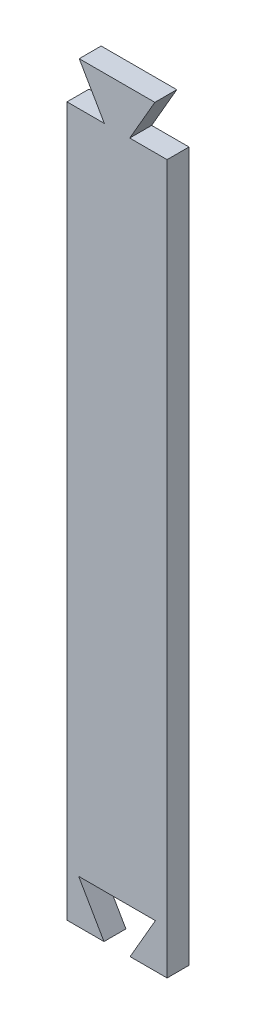
ISO-10303-21;
HEADER;
FILE_DESCRIPTION(('STEP AP214'),'2;1');
FILE_NAME('part.step','',(''),(''),'','','');
FILE_SCHEMA(('AUTOMOTIVE_DESIGN { 1 0 10303 214 1 1 1 1 }'));
ENDSEC;
DATA;
#1=APPLICATION_CONTEXT('core data for automotive mechanical design processes');
#2=APPLICATION_PROTOCOL_DEFINITION('international standard','automotive_design',2000,#1);
#3=PRODUCT_CONTEXT('',#1,'mechanical');
#4=PRODUCT('Part','Part','',(#3));
#5=PRODUCT_RELATED_PRODUCT_CATEGORY('part','',(#4));
#6=PRODUCT_DEFINITION_FORMATION('','',#4);
#7=PRODUCT_DEFINITION_CONTEXT('part definition',#1,'design');
#8=PRODUCT_DEFINITION('design','',#6,#7);
#9=PRODUCT_DEFINITION_SHAPE('','',#8);
#10=(LENGTH_UNIT() NAMED_UNIT(*) SI_UNIT(.MILLI.,.METRE.));
#11=(NAMED_UNIT(*) PLANE_ANGLE_UNIT() SI_UNIT($,.RADIAN.));
#12=(NAMED_UNIT(*) SI_UNIT($,.STERADIAN.) SOLID_ANGLE_UNIT());
#13=UNCERTAINTY_MEASURE_WITH_UNIT(LENGTH_MEASURE(1.E-05),#10,'distance_accuracy_value','');
#14=(GEOMETRIC_REPRESENTATION_CONTEXT(3) GLOBAL_UNCERTAINTY_ASSIGNED_CONTEXT((#13)) GLOBAL_UNIT_ASSIGNED_CONTEXT((#10,
#11,#12)) REPRESENTATION_CONTEXT('',''));
#15=CARTESIAN_POINT('',(0.,0.,0.));
#16=DIRECTION('',(0.,0.,1.));
#17=DIRECTION('',(1.,0.,0.));
#18=AXIS2_PLACEMENT_3D('',#15,#16,#17);
#19=CARTESIAN_POINT('',(-3.02412126503343,0.,5.08));
#20=DIRECTION('',(0.,1.,0.));
#21=DIRECTION('',(0.,0.,1.));
#22=AXIS2_PLACEMENT_3D('',#19,#20,#21);
#23=PLANE('',#22);
#24=DIRECTION('',(1.,0.,0.));
#25=VECTOR('',#24,1.);
#26=CARTESIAN_POINT('',(-3.02412126503343,0.,0.));
#27=LINE('',#26,#25);
#28=CARTESIAN_POINT('',(-11.5976146,0.,0.));
#29=VERTEX_POINT('',#28);
#30=CARTESIAN_POINT('',(-3.02412126503343,0.,0.));
#31=VERTEX_POINT('',#30);
#32=EDGE_CURVE('E163',#29,#31,#27,.T.);
#33=ORIENTED_EDGE('',*,*,#32,.T.);
#34=DIRECTION('',(0.,0.,-1.));
#35=VECTOR('',#34,1.);
#36=CARTESIAN_POINT('',(-3.02412126503343,0.,5.08));
#37=LINE('',#36,#35);
#38=CARTESIAN_POINT('',(-3.02412126503343,0.,5.08));
#39=VERTEX_POINT('',#38);
#40=EDGE_CURVE('E11',#39,#31,#37,.T.);
#41=ORIENTED_EDGE('',*,*,#40,.F.);
#42=DIRECTION('',(1.,0.,0.));
#43=VECTOR('',#42,1.);
#44=CARTESIAN_POINT('',(-3.02412126503343,0.,5.08));
#45=LINE('',#44,#43);
#46=CARTESIAN_POINT('',(-11.5976146,0.,5.08));
#47=VERTEX_POINT('',#46);
#48=EDGE_CURVE('E185',#47,#39,#45,.T.);
#49=ORIENTED_EDGE('',*,*,#48,.F.);
#50=DIRECTION('',(0.,0.,-1.));
#51=VECTOR('',#50,1.);
#52=CARTESIAN_POINT('',(-11.5976146,0.,5.08));
#53=LINE('',#52,#51);
#54=EDGE_CURVE('E159',#47,#29,#53,.T.);
#55=ORIENTED_EDGE('',*,*,#54,.T.);
#56=EDGE_LOOP('',(#33,#41,#49,#55));
#57=FACE_BOUND('',#56,.T.);
#58=ADVANCED_FACE('F43',(#57),#23,.F.);
#59=CARTESIAN_POINT('',(-3.02412126503343,0.,5.08));
#60=DIRECTION('',(-0.86602540378444,-0.499999999999998,0.));
#61=DIRECTION('',(0.499999999999998,-0.86602540378444,0.));
#62=AXIS2_PLACEMENT_3D('',#59,#60,#61);
#63=PLANE('',#62);
#64=DIRECTION('',(-0.499999999999998,0.86602540378444,0.));
#65=VECTOR('',#64,1.);
#66=CARTESIAN_POINT('',(-3.02412126503343,0.,0.));
#67=LINE('',#66,#65);
#68=CARTESIAN_POINT('',(-8.89,10.16,0.));
#69=VERTEX_POINT('',#68);
#70=EDGE_CURVE('E166',#31,#69,#67,.T.);
#71=ORIENTED_EDGE('',*,*,#70,.T.);
#72=DIRECTION('',(0.,0.,-1.));
#73=VECTOR('',#72,1.);
#74=CARTESIAN_POINT('',(-8.89,10.16,5.08));
#75=LINE('',#74,#73);
#76=CARTESIAN_POINT('',(-8.89,10.16,5.08));
#77=VERTEX_POINT('',#76);
#78=EDGE_CURVE('E51',#77,#69,#75,.T.);
#79=ORIENTED_EDGE('',*,*,#78,.F.);
#80=DIRECTION('',(-0.499999999999998,0.86602540378444,0.));
#81=VECTOR('',#80,1.);
#82=CARTESIAN_POINT('',(-3.02412126503343,0.,5.08));
#83=LINE('',#82,#81);
#84=EDGE_CURVE('E114',#39,#77,#83,.T.);
#85=ORIENTED_EDGE('',*,*,#84,.F.);
#86=ORIENTED_EDGE('',*,*,#40,.T.);
#87=EDGE_LOOP('',(#71,#79,#85,#86));
#88=FACE_BOUND('',#87,.T.);
#89=ADVANCED_FACE('F263',(#88),#63,.F.);
#90=CARTESIAN_POINT('',(-8.89,10.16,5.08));
#91=DIRECTION('',(0.,1.,0.));
#92=DIRECTION('',(0.,0.,1.));
#93=AXIS2_PLACEMENT_3D('',#90,#91,#92);
#94=PLANE('',#93);
#95=DIRECTION('',(1.,0.,0.));
#96=VECTOR('',#95,1.);
#97=CARTESIAN_POINT('',(-8.89,10.16,0.));
#98=LINE('',#97,#96);
#99=CARTESIAN_POINT('',(8.89,10.16,0.));
#100=VERTEX_POINT('',#99);
#101=EDGE_CURVE('E168',#69,#100,#98,.T.);
#102=ORIENTED_EDGE('',*,*,#101,.T.);
#103=DIRECTION('',(0.,0.,-1.));
#104=VECTOR('',#103,1.);
#105=CARTESIAN_POINT('',(8.89,10.16,5.08));
#106=LINE('',#105,#104);
#107=CARTESIAN_POINT('',(8.89,10.16,5.08));
#108=VERTEX_POINT('',#107);
#109=EDGE_CURVE('E204',#108,#100,#106,.T.);
#110=ORIENTED_EDGE('',*,*,#109,.F.);
#111=DIRECTION('',(1.,0.,0.));
#112=VECTOR('',#111,1.);
#113=CARTESIAN_POINT('',(-8.89,10.16,5.08));
#114=LINE('',#113,#112);
#115=EDGE_CURVE('E212',#77,#108,#114,.T.);
#116=ORIENTED_EDGE('',*,*,#115,.F.);
#117=ORIENTED_EDGE('',*,*,#78,.T.);
#118=EDGE_LOOP('',(#102,#110,#116,#117));
#119=FACE_BOUND('',#118,.T.);
#120=ADVANCED_FACE('F210',(#119),#94,.F.);
#121=CARTESIAN_POINT('',(8.89,10.16,5.08));
#122=DIRECTION('',(0.866025403784436,-0.500000000000004,0.));
#123=DIRECTION('',(0.500000000000004,0.866025403784436,0.));
#124=AXIS2_PLACEMENT_3D('',#121,#122,#123);
#125=PLANE('',#124);
#126=DIRECTION('',(-0.500000000000004,-0.866025403784436,0.));
#127=VECTOR('',#126,1.);
#128=CARTESIAN_POINT('',(8.89,10.16,0.));
#129=LINE('',#128,#127);
#130=CARTESIAN_POINT('',(3.02412126503334,0.,0.));
#131=VERTEX_POINT('',#130);
#132=EDGE_CURVE('E170',#100,#131,#129,.T.);
#133=ORIENTED_EDGE('',*,*,#132,.T.);
#134=DIRECTION('',(0.,0.,-1.));
#135=VECTOR('',#134,1.);
#136=CARTESIAN_POINT('',(3.02412126503334,0.,5.08));
#137=LINE('',#136,#135);
#138=CARTESIAN_POINT('',(3.02412126503334,0.,5.08));
#139=VERTEX_POINT('',#138);
#140=EDGE_CURVE('E201',#139,#131,#137,.T.);
#141=ORIENTED_EDGE('',*,*,#140,.F.);
#142=DIRECTION('',(-0.500000000000004,-0.866025403784436,0.));
#143=VECTOR('',#142,1.);
#144=CARTESIAN_POINT('',(8.89,10.16,5.08));
#145=LINE('',#144,#143);
#146=EDGE_CURVE('E230',#108,#139,#145,.T.);
#147=ORIENTED_EDGE('',*,*,#146,.F.);
#148=ORIENTED_EDGE('',*,*,#109,.T.);
#149=EDGE_LOOP('',(#133,#141,#147,#148));
#150=FACE_BOUND('',#149,.T.);
#151=ADVANCED_FACE('F221',(#150),#125,.F.);
#152=CARTESIAN_POINT('',(3.02412126503334,0.,5.08));
#153=DIRECTION('',(0.,1.,0.));
#154=DIRECTION('',(0.,0.,1.));
#155=AXIS2_PLACEMENT_3D('',#152,#153,#154);
#156=PLANE('',#155);
#157=DIRECTION('',(1.,0.,0.));
#158=VECTOR('',#157,1.);
#159=CARTESIAN_POINT('',(3.02412126503334,0.,0.));
#160=LINE('',#159,#158);
#161=CARTESIAN_POINT('',(11.5976146,0.,0.));
#162=VERTEX_POINT('',#161);
#163=EDGE_CURVE('E172',#131,#162,#160,.T.);
#164=ORIENTED_EDGE('',*,*,#163,.T.);
#165=DIRECTION('',(0.,0.,-1.));
#166=VECTOR('',#165,1.);
#167=CARTESIAN_POINT('',(11.5976146,0.,5.08));
#168=LINE('',#167,#166);
#169=CARTESIAN_POINT('',(11.5976146,0.,5.08));
#170=VERTEX_POINT('',#169);
#171=EDGE_CURVE('E198',#170,#162,#168,.T.);
#172=ORIENTED_EDGE('',*,*,#171,.F.);
#173=DIRECTION('',(1.,0.,0.));
#174=VECTOR('',#173,1.);
#175=CARTESIAN_POINT('',(3.02412126503334,0.,5.08));
#176=LINE('',#175,#174);
#177=EDGE_CURVE('E227',#139,#170,#176,.T.);
#178=ORIENTED_EDGE('',*,*,#177,.F.);
#179=ORIENTED_EDGE('',*,*,#140,.T.);
#180=EDGE_LOOP('',(#164,#172,#178,#179));
#181=FACE_BOUND('',#180,.T.);
#182=ADVANCED_FACE('F225',(#181),#156,.F.);
#183=CARTESIAN_POINT('',(11.5976146,0.,5.08));
#184=DIRECTION('',(-1.,0.,0.));
#185=DIRECTION('',(0.,0.,1.));
#186=AXIS2_PLACEMENT_3D('',#183,#184,#185);
#187=PLANE('',#186);
#188=DIRECTION('',(0.,1.,0.));
#189=VECTOR('',#188,1.);
#190=CARTESIAN_POINT('',(11.5976146,0.,0.));
#191=LINE('',#190,#189);
#192=CARTESIAN_POINT('',(11.5976146,164.2364,0.));
#193=VERTEX_POINT('',#192);
#194=EDGE_CURVE('E174',#162,#193,#191,.T.);
#195=ORIENTED_EDGE('',*,*,#194,.T.);
#196=DIRECTION('',(0.,0.,-1.));
#197=VECTOR('',#196,1.);
#198=CARTESIAN_POINT('',(11.5976146,164.2364,5.08));
#199=LINE('',#198,#197);
#200=CARTESIAN_POINT('',(11.5976146,164.2364,5.08));
#201=VERTEX_POINT('',#200);
#202=EDGE_CURVE('E195',#201,#193,#199,.T.);
#203=ORIENTED_EDGE('',*,*,#202,.F.);
#204=DIRECTION('',(0.,1.,0.));
#205=VECTOR('',#204,1.);
#206=CARTESIAN_POINT('',(11.5976146,0.,5.08));
#207=LINE('',#206,#205);
#208=EDGE_CURVE('E229',#170,#201,#207,.T.);
#209=ORIENTED_EDGE('',*,*,#208,.F.);
#210=ORIENTED_EDGE('',*,*,#171,.T.);
#211=EDGE_LOOP('',(#195,#203,#209,#210));
#212=FACE_BOUND('',#211,.T.);
#213=ADVANCED_FACE('F276',(#212),#187,.F.);
#214=CARTESIAN_POINT('',(11.5976146,164.2364,5.08));
#215=DIRECTION('',(0.,-1.,0.));
#216=DIRECTION('',(0.,0.,-1.));
#217=AXIS2_PLACEMENT_3D('',#214,#215,#216);
#218=PLANE('',#217);
#219=DIRECTION('',(-1.,0.,0.));
#220=VECTOR('',#219,1.);
#221=CARTESIAN_POINT('',(11.5976146,164.2364,0.));
#222=LINE('',#221,#220);
#223=CARTESIAN_POINT('',(2.94111535554568,164.2364,0.));
#224=VERTEX_POINT('',#223);
#225=EDGE_CURVE('E176',#193,#224,#222,.T.);
#226=ORIENTED_EDGE('',*,*,#225,.T.);
#227=DIRECTION('',(0.,0.,-1.));
#228=VECTOR('',#227,1.);
#229=CARTESIAN_POINT('',(2.94111535554568,164.2364,5.08));
#230=LINE('',#229,#228);
#231=CARTESIAN_POINT('',(2.94111535554568,164.2364,5.08));
#232=VERTEX_POINT('',#231);
#233=EDGE_CURVE('E192',#232,#224,#230,.T.);
#234=ORIENTED_EDGE('',*,*,#233,.F.);
#235=DIRECTION('',(-1.,0.,0.));
#236=VECTOR('',#235,1.);
#237=CARTESIAN_POINT('',(11.5976146,164.2364,5.08));
#238=LINE('',#237,#236);
#239=EDGE_CURVE('E232',#201,#232,#238,.T.);
#240=ORIENTED_EDGE('',*,*,#239,.F.);
#241=ORIENTED_EDGE('',*,*,#202,.T.);
#242=EDGE_LOOP('',(#226,#234,#240,#241));
#243=FACE_BOUND('',#242,.T.);
#244=ADVANCED_FACE('F279',(#243),#218,.F.);
#245=CARTESIAN_POINT('',(8.763,174.3202,5.08));
#246=DIRECTION('',(-0.86602540378444,0.499999999999998,0.));
#247=DIRECTION('',(-0.499999999999998,-0.86602540378444,0.));
#248=AXIS2_PLACEMENT_3D('',#245,#246,#247);
#249=PLANE('',#248);
#250=DIRECTION('',(0.499999999999998,0.86602540378444,0.));
#251=VECTOR('',#250,1.);
#252=CARTESIAN_POINT('',(8.763,174.3202,0.));
#253=LINE('',#252,#251);
#254=CARTESIAN_POINT('',(8.763,174.3202,0.));
#255=VERTEX_POINT('',#254);
#256=EDGE_CURVE('E178',#224,#255,#253,.T.);
#257=ORIENTED_EDGE('',*,*,#256,.T.);
#258=DIRECTION('',(0.,0.,-1.));
#259=VECTOR('',#258,1.);
#260=CARTESIAN_POINT('',(8.763,174.3202,5.08));
#261=LINE('',#260,#259);
#262=CARTESIAN_POINT('',(8.763,174.3202,5.08));
#263=VERTEX_POINT('',#262);
#264=EDGE_CURVE('E189',#263,#255,#261,.T.);
#265=ORIENTED_EDGE('',*,*,#264,.F.);
#266=DIRECTION('',(0.499999999999998,0.86602540378444,0.));
#267=VECTOR('',#266,1.);
#268=CARTESIAN_POINT('',(8.763,174.3202,5.08));
#269=LINE('',#268,#267);
#270=EDGE_CURVE('E238',#232,#263,#269,.T.);
#271=ORIENTED_EDGE('',*,*,#270,.F.);
#272=ORIENTED_EDGE('',*,*,#233,.T.);
#273=EDGE_LOOP('',(#257,#265,#271,#272));
#274=FACE_BOUND('',#273,.T.);
#275=ADVANCED_FACE('F244',(#274),#249,.F.);
#276=CARTESIAN_POINT('',(-8.763,174.3202,5.08));
#277=DIRECTION('',(0.,-1.,0.));
#278=DIRECTION('',(0.,0.,-1.));
#279=AXIS2_PLACEMENT_3D('',#276,#277,#278);
#280=PLANE('',#279);
#281=DIRECTION('',(-1.,0.,0.));
#282=VECTOR('',#281,1.);
#283=CARTESIAN_POINT('',(-8.763,174.3202,0.));
#284=LINE('',#283,#282);
#285=CARTESIAN_POINT('',(-8.763,174.3202,0.));
#286=VERTEX_POINT('',#285);
#287=EDGE_CURVE('E180',#255,#286,#284,.T.);
#288=ORIENTED_EDGE('',*,*,#287,.T.);
#289=DIRECTION('',(0.,0.,-1.));
#290=VECTOR('',#289,1.);
#291=CARTESIAN_POINT('',(-8.763,174.3202,5.08));
#292=LINE('',#291,#290);
#293=CARTESIAN_POINT('',(-8.763,174.3202,5.08));
#294=VERTEX_POINT('',#293);
#295=EDGE_CURVE('E154',#294,#286,#292,.T.);
#296=ORIENTED_EDGE('',*,*,#295,.F.);
#297=DIRECTION('',(-1.,0.,0.));
#298=VECTOR('',#297,1.);
#299=CARTESIAN_POINT('',(-8.763,174.3202,5.08));
#300=LINE('',#299,#298);
#301=EDGE_CURVE('E145',#263,#294,#300,.T.);
#302=ORIENTED_EDGE('',*,*,#301,.F.);
#303=ORIENTED_EDGE('',*,*,#264,.T.);
#304=EDGE_LOOP('',(#288,#296,#302,#303));
#305=FACE_BOUND('',#304,.T.);
#306=ADVANCED_FACE('F248',(#305),#280,.F.);
#307=CARTESIAN_POINT('',(-2.94111535554568,164.2364,5.08));
#308=DIRECTION('',(0.86602540378444,0.499999999999998,0.));
#309=DIRECTION('',(-0.499999999999998,0.86602540378444,0.));
#310=AXIS2_PLACEMENT_3D('',#307,#308,#309);
#311=PLANE('',#310);
#312=DIRECTION('',(0.499999999999998,-0.86602540378444,0.));
#313=VECTOR('',#312,1.);
#314=CARTESIAN_POINT('',(-2.94111535554568,164.2364,0.));
#315=LINE('',#314,#313);
#316=CARTESIAN_POINT('',(-2.94111535554568,164.2364,0.));
#317=VERTEX_POINT('',#316);
#318=EDGE_CURVE('E153',#286,#317,#315,.T.);
#319=ORIENTED_EDGE('',*,*,#318,.T.);
#320=DIRECTION('',(0.,0.,-1.));
#321=VECTOR('',#320,1.);
#322=CARTESIAN_POINT('',(-2.94111535554568,164.2364,5.08));
#323=LINE('',#322,#321);
#324=CARTESIAN_POINT('',(-2.94111535554568,164.2364,5.08));
#325=VERTEX_POINT('',#324);
#326=EDGE_CURVE('E150',#325,#317,#323,.T.);
#327=ORIENTED_EDGE('',*,*,#326,.F.);
#328=DIRECTION('',(0.499999999999998,-0.86602540378444,0.));
#329=VECTOR('',#328,1.);
#330=CARTESIAN_POINT('',(-2.94111535554568,164.2364,5.08));
#331=LINE('',#330,#329);
#332=EDGE_CURVE('E139',#294,#325,#331,.T.);
#333=ORIENTED_EDGE('',*,*,#332,.F.);
#334=ORIENTED_EDGE('',*,*,#295,.T.);
#335=EDGE_LOOP('',(#319,#327,#333,#334));
#336=FACE_BOUND('',#335,.T.);
#337=ADVANCED_FACE('F151',(#336),#311,.F.);
#338=CARTESIAN_POINT('',(-2.94111535554568,164.2364,5.08));
#339=DIRECTION('',(0.,-1.,0.));
#340=DIRECTION('',(0.,0.,-1.));
#341=AXIS2_PLACEMENT_3D('',#338,#339,#340);
#342=PLANE('',#341);
#343=DIRECTION('',(-1.,0.,0.));
#344=VECTOR('',#343,1.);
#345=CARTESIAN_POINT('',(-2.94111535554568,164.2364,0.));
#346=LINE('',#345,#344);
#347=CARTESIAN_POINT('',(-11.5976146,164.2364,0.));
#348=VERTEX_POINT('',#347);
#349=EDGE_CURVE('E100',#317,#348,#346,.T.);
#350=ORIENTED_EDGE('',*,*,#349,.T.);
#351=DIRECTION('',(0.,0.,-1.));
#352=VECTOR('',#351,1.);
#353=CARTESIAN_POINT('',(-11.5976146,164.2364,5.08));
#354=LINE('',#353,#352);
#355=CARTESIAN_POINT('',(-11.5976146,164.2364,5.08));
#356=VERTEX_POINT('',#355);
#357=EDGE_CURVE('E155',#356,#348,#354,.T.);
#358=ORIENTED_EDGE('',*,*,#357,.F.);
#359=DIRECTION('',(-1.,0.,0.));
#360=VECTOR('',#359,1.);
#361=CARTESIAN_POINT('',(-2.94111535554568,164.2364,5.08));
#362=LINE('',#361,#360);
#363=EDGE_CURVE('E143',#325,#356,#362,.T.);
#364=ORIENTED_EDGE('',*,*,#363,.F.);
#365=ORIENTED_EDGE('',*,*,#326,.T.);
#366=EDGE_LOOP('',(#350,#358,#364,#365));
#367=FACE_BOUND('',#366,.T.);
#368=ADVANCED_FACE('F157',(#367),#342,.F.);
#369=CARTESIAN_POINT('',(-11.5976146,0.,5.08));
#370=DIRECTION('',(1.,0.,0.));
#371=DIRECTION('',(0.,0.,-1.));
#372=AXIS2_PLACEMENT_3D('',#369,#370,#371);
#373=PLANE('',#372);
#374=DIRECTION('',(0.,-1.,0.));
#375=VECTOR('',#374,1.);
#376=CARTESIAN_POINT('',(-11.5976146,0.,0.));
#377=LINE('',#376,#375);
#378=EDGE_CURVE('E106',#348,#29,#377,.T.);
#379=ORIENTED_EDGE('',*,*,#378,.T.);
#380=ORIENTED_EDGE('',*,*,#54,.F.);
#381=DIRECTION('',(0.,-1.,0.));
#382=VECTOR('',#381,1.);
#383=CARTESIAN_POINT('',(-11.5976146,0.,5.08));
#384=LINE('',#383,#382);
#385=EDGE_CURVE('E59',#356,#47,#384,.T.);
#386=ORIENTED_EDGE('',*,*,#385,.F.);
#387=ORIENTED_EDGE('',*,*,#357,.T.);
#388=EDGE_LOOP('',(#379,#380,#386,#387));
#389=FACE_BOUND('',#388,.T.);
#390=ADVANCED_FACE('F252',(#389),#373,.F.);
#391=CARTESIAN_POINT('',(0.,0.,5.08));
#392=DIRECTION('',(0.,0.,-1.));
#393=DIRECTION('',(-1.,0.,0.));
#394=AXIS2_PLACEMENT_3D('',#391,#392,#393);
#395=PLANE('',#394);
#396=ORIENTED_EDGE('',*,*,#48,.T.);
#397=ORIENTED_EDGE('',*,*,#84,.T.);
#398=ORIENTED_EDGE('',*,*,#115,.T.);
#399=ORIENTED_EDGE('',*,*,#146,.T.);
#400=ORIENTED_EDGE('',*,*,#177,.T.);
#401=ORIENTED_EDGE('',*,*,#208,.T.);
#402=ORIENTED_EDGE('',*,*,#239,.T.);
#403=ORIENTED_EDGE('',*,*,#270,.T.);
#404=ORIENTED_EDGE('',*,*,#301,.T.);
#405=ORIENTED_EDGE('',*,*,#332,.T.);
#406=ORIENTED_EDGE('',*,*,#363,.T.);
#407=ORIENTED_EDGE('',*,*,#385,.T.);
#408=EDGE_LOOP('',(#396,#397,#398,#399,#400,#401,#402,#403,#404,#405,#406,#407));
#409=FACE_BOUND('',#408,.T.);
#410=ADVANCED_FACE('F141',(#409),#395,.F.);
#411=CARTESIAN_POINT('',(0.,0.,0.));
#412=DIRECTION('',(0.,0.,-1.));
#413=DIRECTION('',(-1.,0.,0.));
#414=AXIS2_PLACEMENT_3D('',#411,#412,#413);
#415=PLANE('',#414);
#416=ORIENTED_EDGE('',*,*,#32,.F.);
#417=ORIENTED_EDGE('',*,*,#378,.F.);
#418=ORIENTED_EDGE('',*,*,#349,.F.);
#419=ORIENTED_EDGE('',*,*,#318,.F.);
#420=ORIENTED_EDGE('',*,*,#287,.F.);
#421=ORIENTED_EDGE('',*,*,#256,.F.);
#422=ORIENTED_EDGE('',*,*,#225,.F.);
#423=ORIENTED_EDGE('',*,*,#194,.F.);
#424=ORIENTED_EDGE('',*,*,#163,.F.);
#425=ORIENTED_EDGE('',*,*,#132,.F.);
#426=ORIENTED_EDGE('',*,*,#101,.F.);
#427=ORIENTED_EDGE('',*,*,#70,.F.);
#428=EDGE_LOOP('',(#416,#417,#418,#419,#420,#421,#422,#423,#424,#425,#426,#427));
#429=FACE_BOUND('',#428,.T.);
#430=ADVANCED_FACE('F216',(#429),#415,.T.);
#431=CLOSED_SHELL('',(#58,#89,#120,#151,#182,#213,#244,#275,#306,#337,#368,#390,#410,#430));
#432=MANIFOLD_SOLID_BREP('B2',#431);
#433=ADVANCED_BREP_SHAPE_REPRESENTATION('',(#18,#432),#14);
#434=SHAPE_DEFINITION_REPRESENTATION(#9,#433);
ENDSEC;
END-ISO-10303-21;
